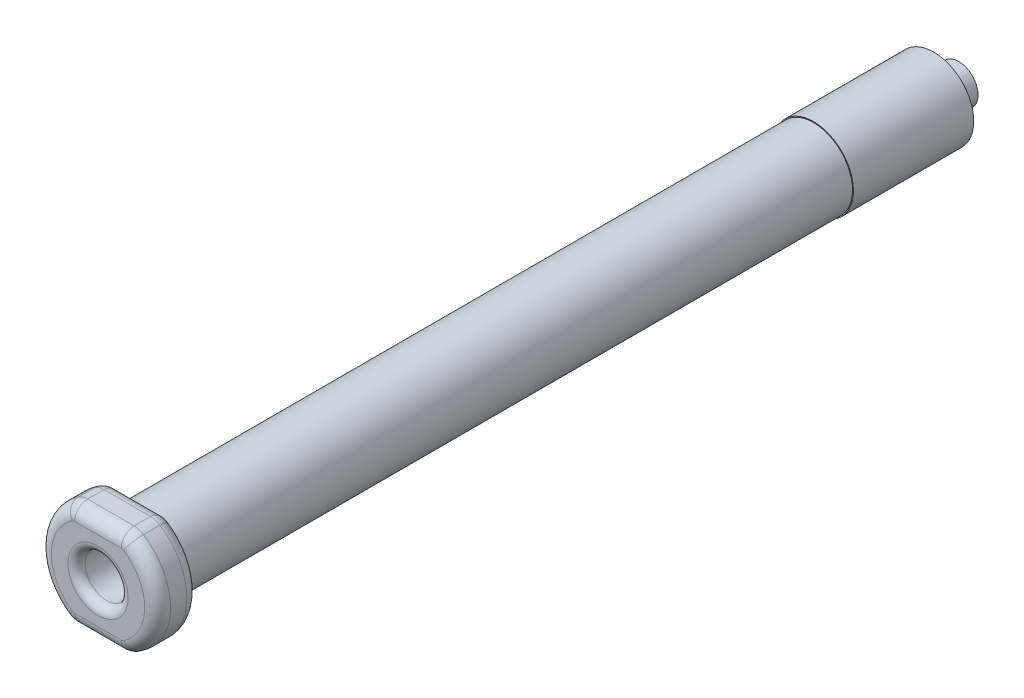
ISO-10303-21;
HEADER;
FILE_DESCRIPTION(('STEP AP214'),'2;1');
FILE_NAME('part.step','',(''),(''),'','','');
FILE_SCHEMA(('AUTOMOTIVE_DESIGN { 1 0 10303 214 1 1 1 1 }'));
ENDSEC;
DATA;
#1=APPLICATION_CONTEXT('core data for automotive mechanical design processes');
#2=APPLICATION_PROTOCOL_DEFINITION('international standard','automotive_design',2000,#1);
#3=PRODUCT_CONTEXT('',#1,'mechanical');
#4=PRODUCT('Part','Part','',(#3));
#5=PRODUCT_RELATED_PRODUCT_CATEGORY('part','',(#4));
#6=PRODUCT_DEFINITION_FORMATION('','',#4);
#7=PRODUCT_DEFINITION_CONTEXT('part definition',#1,'design');
#8=PRODUCT_DEFINITION('design','',#6,#7);
#9=PRODUCT_DEFINITION_SHAPE('','',#8);
#10=(LENGTH_UNIT() NAMED_UNIT(*) SI_UNIT(.MILLI.,.METRE.));
#11=(NAMED_UNIT(*) PLANE_ANGLE_UNIT() SI_UNIT($,.RADIAN.));
#12=(NAMED_UNIT(*) SI_UNIT($,.STERADIAN.) SOLID_ANGLE_UNIT());
#13=UNCERTAINTY_MEASURE_WITH_UNIT(LENGTH_MEASURE(1.E-05),#10,'distance_accuracy_value','');
#14=(GEOMETRIC_REPRESENTATION_CONTEXT(3) GLOBAL_UNCERTAINTY_ASSIGNED_CONTEXT((#13)) GLOBAL_UNIT_ASSIGNED_CONTEXT((#10,
#11,#12)) REPRESENTATION_CONTEXT('',''));
#15=CARTESIAN_POINT('',(0.,0.,0.));
#16=DIRECTION('',(0.,0.,1.));
#17=DIRECTION('',(1.,0.,0.));
#18=AXIS2_PLACEMENT_3D('',#15,#16,#17);
#19=CARTESIAN_POINT('',(0.,0.,83.25));
#20=DIRECTION('',(0.,0.,-1.));
#21=DIRECTION('',(-1.,0.,0.));
#22=AXIS2_PLACEMENT_3D('',#19,#20,#21);
#23=CYLINDRICAL_SURFACE('',#22,4.55);
#24=CARTESIAN_POINT('',(0.,0.,0.));
#25=DIRECTION('',(0.,0.,1.));
#26=DIRECTION('',(1.,0.,0.));
#27=AXIS2_PLACEMENT_3D('',#24,#25,#26);
#28=CIRCLE('',#27,4.55);
#29=CARTESIAN_POINT('',(4.55,0.,0.));
#30=VERTEX_POINT('',#29);
#31=EDGE_CURVE('E229',#30,#30,#28,.T.);
#32=ORIENTED_EDGE('',*,*,#31,.T.);
#33=EDGE_LOOP('',(#32));
#34=FACE_BOUND('',#33,.T.);
#35=CARTESIAN_POINT('',(0.,0.,78.35));
#36=DIRECTION('',(0.,0.,1.));
#37=DIRECTION('',(1.,0.,0.));
#38=AXIS2_PLACEMENT_3D('',#35,#36,#37);
#39=CIRCLE('',#38,4.55);
#40=CARTESIAN_POINT('',(4.55,0.,78.35));
#41=VERTEX_POINT('',#40);
#42=EDGE_CURVE('E491',#41,#41,#39,.T.);
#43=ORIENTED_EDGE('',*,*,#42,.F.);
#44=EDGE_LOOP('',(#43));
#45=FACE_BOUND('',#44,.T.);
#46=ADVANCED_FACE('F45',(#34,#45),#23,.T.);
#47=CARTESIAN_POINT('',(0.,0.,78.35));
#48=DIRECTION('',(0.,0.,1.));
#49=DIRECTION('',(1.,0.,0.));
#50=AXIS2_PLACEMENT_3D('',#47,#48,#49);
#51=CYLINDRICAL_SURFACE('',#50,6.93383912417933);
#52=DIRECTION('',(0.,0.,1.));
#53=VECTOR('',#52,1.);
#54=CARTESIAN_POINT('',(-3.80413679256897,5.79712586230652,78.35));
#55=LINE('',#54,#53);
#56=CARTESIAN_POINT('',(-3.80413679256897,5.79712586230652,81.75));
#57=VERTEX_POINT('',#56);
#58=CARTESIAN_POINT('',(-3.80413679256897,5.79712586230652,79.85));
#59=VERTEX_POINT('',#58);
#60=EDGE_CURVE('E431',#57,#59,#55,.F.);
#61=ORIENTED_EDGE('',*,*,#60,.T.);
#62=CARTESIAN_POINT('',(0.,0.,79.85));
#63=DIRECTION('',(0.,0.,1.));
#64=DIRECTION('',(1.,0.,0.));
#65=AXIS2_PLACEMENT_3D('',#62,#63,#64);
#66=CIRCLE('',#65,6.93383912417933);
#67=CARTESIAN_POINT('',(-3.80413679256897,-5.79712586230652,79.85));
#68=VERTEX_POINT('',#67);
#69=EDGE_CURVE('E253',#59,#68,#66,.T.);
#70=ORIENTED_EDGE('',*,*,#69,.T.);
#71=DIRECTION('',(0.,0.,1.));
#72=VECTOR('',#71,1.);
#73=CARTESIAN_POINT('',(-3.80413679256897,-5.79712586230652,78.35));
#74=LINE('',#73,#72);
#75=CARTESIAN_POINT('',(-3.80413679256897,-5.79712586230652,81.75));
#76=VERTEX_POINT('',#75);
#77=EDGE_CURVE('E429',#68,#76,#74,.T.);
#78=ORIENTED_EDGE('',*,*,#77,.T.);
#79=CARTESIAN_POINT('',(0.,0.,81.75));
#80=DIRECTION('',(0.,0.,1.));
#81=DIRECTION('',(1.,0.,0.));
#82=AXIS2_PLACEMENT_3D('',#79,#80,#81);
#83=CIRCLE('',#82,6.93383912417933);
#84=EDGE_CURVE('E199',#76,#57,#83,.F.);
#85=ORIENTED_EDGE('',*,*,#84,.T.);
#86=EDGE_LOOP('',(#61,#70,#78,#85));
#87=FACE_BOUND('',#86,.T.);
#88=ADVANCED_FACE('F298',(#87),#51,.T.);
#89=CARTESIAN_POINT('',(-3.25,6.125,78.35));
#90=DIRECTION('',(0.,1.,0.));
#91=DIRECTION('',(0.,0.,1.));
#92=AXIS2_PLACEMENT_3D('',#89,#90,#91);
#93=PLANE('',#92);
#94=DIRECTION('',(0.,0.,1.));
#95=VECTOR('',#94,1.);
#96=CARTESIAN_POINT('',(2.70686968716314,6.125,78.35));
#97=LINE('',#96,#95);
#98=CARTESIAN_POINT('',(2.70686968716314,6.125,81.75));
#99=VERTEX_POINT('',#98);
#100=CARTESIAN_POINT('',(2.70686968716314,6.125,79.85));
#101=VERTEX_POINT('',#100);
#102=EDGE_CURVE('E182',#99,#101,#97,.F.);
#103=ORIENTED_EDGE('',*,*,#102,.T.);
#104=DIRECTION('',(-1.,0.,0.));
#105=VECTOR('',#104,1.);
#106=CARTESIAN_POINT('',(-2.70686968716314,6.125,79.85));
#107=LINE('',#106,#105);
#108=CARTESIAN_POINT('',(-2.70686968716314,6.125,79.85));
#109=VERTEX_POINT('',#108);
#110=EDGE_CURVE('E257',#101,#109,#107,.T.);
#111=ORIENTED_EDGE('',*,*,#110,.T.);
#112=DIRECTION('',(0.,0.,1.));
#113=VECTOR('',#112,1.);
#114=CARTESIAN_POINT('',(-2.70686968716314,6.125,78.35));
#115=LINE('',#114,#113);
#116=CARTESIAN_POINT('',(-2.70686968716314,6.125,81.75));
#117=VERTEX_POINT('',#116);
#118=EDGE_CURVE('E449',#109,#117,#115,.T.);
#119=ORIENTED_EDGE('',*,*,#118,.T.);
#120=DIRECTION('',(-1.,0.,0.));
#121=VECTOR('',#120,1.);
#122=CARTESIAN_POINT('',(-3.25,6.125,81.75));
#123=LINE('',#122,#121);
#124=EDGE_CURVE('E204',#117,#99,#123,.F.);
#125=ORIENTED_EDGE('',*,*,#124,.T.);
#126=EDGE_LOOP('',(#103,#111,#119,#125));
#127=FACE_BOUND('',#126,.T.);
#128=ADVANCED_FACE('F304',(#127),#93,.T.);
#129=CARTESIAN_POINT('',(0.,0.,78.35));
#130=DIRECTION('',(0.,0.,1.));
#131=DIRECTION('',(1.,0.,0.));
#132=AXIS2_PLACEMENT_3D('',#129,#130,#131);
#133=CYLINDRICAL_SURFACE('',#132,6.93383912417933);
#134=DIRECTION('',(0.,0.,1.));
#135=VECTOR('',#134,1.);
#136=CARTESIAN_POINT('',(3.80413679256897,-5.79712586230652,78.35));
#137=LINE('',#136,#135);
#138=CARTESIAN_POINT('',(3.80413679256897,-5.79712586230652,81.75));
#139=VERTEX_POINT('',#138);
#140=CARTESIAN_POINT('',(3.80413679256897,-5.79712586230652,79.85));
#141=VERTEX_POINT('',#140);
#142=EDGE_CURVE('E447',#139,#141,#137,.F.);
#143=ORIENTED_EDGE('',*,*,#142,.T.);
#144=CARTESIAN_POINT('',(0.,0.,79.85));
#145=DIRECTION('',(0.,0.,1.));
#146=DIRECTION('',(1.,0.,0.));
#147=AXIS2_PLACEMENT_3D('',#144,#145,#146);
#148=CIRCLE('',#147,6.93383912417933);
#149=CARTESIAN_POINT('',(3.80413679256897,5.79712586230652,79.85));
#150=VERTEX_POINT('',#149);
#151=EDGE_CURVE('E60',#141,#150,#148,.T.);
#152=ORIENTED_EDGE('',*,*,#151,.T.);
#153=DIRECTION('',(0.,0.,1.));
#154=VECTOR('',#153,1.);
#155=CARTESIAN_POINT('',(3.80413679256897,5.79712586230652,78.35));
#156=LINE('',#155,#154);
#157=CARTESIAN_POINT('',(3.80413679256897,5.79712586230652,81.75));
#158=VERTEX_POINT('',#157);
#159=EDGE_CURVE('E445',#150,#158,#156,.T.);
#160=ORIENTED_EDGE('',*,*,#159,.T.);
#161=CARTESIAN_POINT('',(0.,0.,81.75));
#162=DIRECTION('',(0.,0.,1.));
#163=DIRECTION('',(1.,0.,0.));
#164=AXIS2_PLACEMENT_3D('',#161,#162,#163);
#165=CIRCLE('',#164,6.93383912417933);
#166=EDGE_CURVE('E209',#158,#139,#165,.F.);
#167=ORIENTED_EDGE('',*,*,#166,.T.);
#168=EDGE_LOOP('',(#143,#152,#160,#167));
#169=FACE_BOUND('',#168,.T.);
#170=ADVANCED_FACE('F318',(#169),#133,.T.);
#171=CARTESIAN_POINT('',(-3.25,-6.125,78.35));
#172=DIRECTION('',(0.,-1.,0.));
#173=DIRECTION('',(0.,0.,-1.));
#174=AXIS2_PLACEMENT_3D('',#171,#172,#173);
#175=PLANE('',#174);
#176=DIRECTION('',(0.,0.,1.));
#177=VECTOR('',#176,1.);
#178=CARTESIAN_POINT('',(-2.70686968716314,-6.125,78.35));
#179=LINE('',#178,#177);
#180=CARTESIAN_POINT('',(-2.70686968716314,-6.125,81.75));
#181=VERTEX_POINT('',#180);
#182=CARTESIAN_POINT('',(-2.70686968716314,-6.125,79.85));
#183=VERTEX_POINT('',#182);
#184=EDGE_CURVE('E438',#181,#183,#179,.F.);
#185=ORIENTED_EDGE('',*,*,#184,.T.);
#186=DIRECTION('',(1.,0.,0.));
#187=VECTOR('',#186,1.);
#188=CARTESIAN_POINT('',(2.70686968716314,-6.125,79.85));
#189=LINE('',#188,#187);
#190=CARTESIAN_POINT('',(2.70686968716314,-6.125,79.85));
#191=VERTEX_POINT('',#190);
#192=EDGE_CURVE('E249',#183,#191,#189,.T.);
#193=ORIENTED_EDGE('',*,*,#192,.T.);
#194=DIRECTION('',(0.,0.,1.));
#195=VECTOR('',#194,1.);
#196=CARTESIAN_POINT('',(2.70686968716314,-6.125,78.35));
#197=LINE('',#196,#195);
#198=CARTESIAN_POINT('',(2.70686968716314,-6.125,81.75));
#199=VERTEX_POINT('',#198);
#200=EDGE_CURVE('E436',#191,#199,#197,.T.);
#201=ORIENTED_EDGE('',*,*,#200,.T.);
#202=DIRECTION('',(1.,0.,0.));
#203=VECTOR('',#202,1.);
#204=CARTESIAN_POINT('',(-3.25,-6.125,81.75));
#205=LINE('',#204,#203);
#206=EDGE_CURVE('E189',#199,#181,#205,.F.);
#207=ORIENTED_EDGE('',*,*,#206,.T.);
#208=EDGE_LOOP('',(#185,#193,#201,#207));
#209=FACE_BOUND('',#208,.T.);
#210=ADVANCED_FACE('F315',(#209),#175,.T.);
#211=CARTESIAN_POINT('',(0.,0.,78.35));
#212=DIRECTION('',(0.,0.,1.));
#213=DIRECTION('',(1.,0.,0.));
#214=AXIS2_PLACEMENT_3D('',#211,#212,#213);
#215=PLANE('',#214);
#216=CARTESIAN_POINT('',(0.,0.,78.35));
#217=DIRECTION('',(0.,0.,1.));
#218=DIRECTION('',(1.,0.,0.));
#219=AXIS2_PLACEMENT_3D('',#216,#217,#218);
#220=CIRCLE('',#219,5.43383912417933);
#221=CARTESIAN_POINT('',(2.9811864635146,4.54303146557663,78.35));
#222=VERTEX_POINT('',#221);
#223=CARTESIAN_POINT('',(2.9811864635146,-4.54303146557663,78.35));
#224=VERTEX_POINT('',#223);
#225=EDGE_CURVE('E210',#222,#224,#220,.F.);
#226=ORIENTED_EDGE('',*,*,#225,.T.);
#227=CARTESIAN_POINT('',(2.70686968716314,-4.125,78.35));
#228=DIRECTION('',(0.,0.,1.));
#229=DIRECTION('',(1.,0.,0.));
#230=AXIS2_PLACEMENT_3D('',#227,#228,#229);
#231=CIRCLE('',#230,0.5);
#232=CARTESIAN_POINT('',(2.70686968716314,-4.625,78.35));
#233=VERTEX_POINT('',#232);
#234=EDGE_CURVE('E243',#224,#233,#231,.F.);
#235=ORIENTED_EDGE('',*,*,#234,.T.);
#236=DIRECTION('',(1.,0.,0.));
#237=VECTOR('',#236,1.);
#238=CARTESIAN_POINT('',(-2.70686968716314,-4.625,78.35));
#239=LINE('',#238,#237);
#240=CARTESIAN_POINT('',(-2.70686968716314,-4.625,78.35));
#241=VERTEX_POINT('',#240);
#242=EDGE_CURVE('E241',#233,#241,#239,.F.);
#243=ORIENTED_EDGE('',*,*,#242,.T.);
#244=CARTESIAN_POINT('',(-2.70686968716314,-4.125,78.35));
#245=DIRECTION('',(0.,0.,1.));
#246=DIRECTION('',(1.,0.,0.));
#247=AXIS2_PLACEMENT_3D('',#244,#245,#246);
#248=CIRCLE('',#247,0.5);
#249=CARTESIAN_POINT('',(-2.9811864635146,-4.54303146557663,78.35));
#250=VERTEX_POINT('',#249);
#251=EDGE_CURVE('E239',#241,#250,#248,.F.);
#252=ORIENTED_EDGE('',*,*,#251,.T.);
#253=CARTESIAN_POINT('',(0.,0.,78.35));
#254=DIRECTION('',(0.,0.,1.));
#255=DIRECTION('',(1.,0.,0.));
#256=AXIS2_PLACEMENT_3D('',#253,#254,#255);
#257=CIRCLE('',#256,5.43383912417933);
#258=CARTESIAN_POINT('',(-2.9811864635146,4.54303146557663,78.35));
#259=VERTEX_POINT('',#258);
#260=EDGE_CURVE('E237',#250,#259,#257,.F.);
#261=ORIENTED_EDGE('',*,*,#260,.T.);
#262=CARTESIAN_POINT('',(-2.70686968716314,4.125,78.35));
#263=DIRECTION('',(0.,0.,1.));
#264=DIRECTION('',(1.,0.,0.));
#265=AXIS2_PLACEMENT_3D('',#262,#263,#264);
#266=CIRCLE('',#265,0.5);
#267=CARTESIAN_POINT('',(-2.70686968716314,4.625,78.35));
#268=VERTEX_POINT('',#267);
#269=EDGE_CURVE('E235',#259,#268,#266,.F.);
#270=ORIENTED_EDGE('',*,*,#269,.T.);
#271=DIRECTION('',(-1.,0.,0.));
#272=VECTOR('',#271,1.);
#273=CARTESIAN_POINT('',(2.70686968716314,4.625,78.35));
#274=LINE('',#273,#272);
#275=CARTESIAN_POINT('',(2.70686968716314,4.625,78.35));
#276=VERTEX_POINT('',#275);
#277=EDGE_CURVE('E233',#268,#276,#274,.F.);
#278=ORIENTED_EDGE('',*,*,#277,.T.);
#279=CARTESIAN_POINT('',(2.70686968716314,4.125,78.35));
#280=DIRECTION('',(0.,0.,1.));
#281=DIRECTION('',(1.,0.,0.));
#282=AXIS2_PLACEMENT_3D('',#279,#280,#281);
#283=CIRCLE('',#282,0.5);
#284=EDGE_CURVE('E231',#276,#222,#283,.F.);
#285=ORIENTED_EDGE('',*,*,#284,.T.);
#286=EDGE_LOOP('',(#226,#235,#243,#252,#261,#270,#278,#285));
#287=FACE_BOUND('',#286,.T.);
#288=ORIENTED_EDGE('',*,*,#42,.T.);
#289=EDGE_LOOP('',(#288));
#290=FACE_BOUND('',#289,.T.);
#291=ADVANCED_FACE('F312',(#287,#290),#215,.F.);
#292=CARTESIAN_POINT('',(0.,0.,83.25));
#293=DIRECTION('',(0.,0.,1.));
#294=DIRECTION('',(1.,0.,0.));
#295=AXIS2_PLACEMENT_3D('',#292,#293,#294);
#296=PLANE('',#295);
#297=CARTESIAN_POINT('',(0.,0.,83.25));
#298=DIRECTION('',(0.,0.,1.));
#299=DIRECTION('',(1.,0.,0.));
#300=AXIS2_PLACEMENT_3D('',#297,#298,#299);
#301=CIRCLE('',#300,3.5);
#302=CARTESIAN_POINT('',(3.5,0.,83.25));
#303=VERTEX_POINT('',#302);
#304=EDGE_CURVE('E12',#303,#303,#301,.F.);
#305=ORIENTED_EDGE('',*,*,#304,.T.);
#306=EDGE_LOOP('',(#305));
#307=FACE_BOUND('',#306,.T.);
#308=DIRECTION('',(1.,0.,0.));
#309=VECTOR('',#308,1.);
#310=CARTESIAN_POINT('',(0.,-4.625,83.25));
#311=LINE('',#310,#309);
#312=CARTESIAN_POINT('',(-2.70686968716314,-4.625,83.25));
#313=VERTEX_POINT('',#312);
#314=CARTESIAN_POINT('',(2.70686968716314,-4.625,83.25));
#315=VERTEX_POINT('',#314);
#316=EDGE_CURVE('E186',#313,#315,#311,.T.);
#317=ORIENTED_EDGE('',*,*,#316,.T.);
#318=CARTESIAN_POINT('',(2.70686968716314,-4.125,83.25));
#319=DIRECTION('',(0.,0.,1.));
#320=DIRECTION('',(1.,0.,0.));
#321=AXIS2_PLACEMENT_3D('',#318,#319,#320);
#322=CIRCLE('',#321,0.5);
#323=CARTESIAN_POINT('',(2.9811864635146,-4.54303146557663,83.25));
#324=VERTEX_POINT('',#323);
#325=EDGE_CURVE('E166',#315,#324,#322,.T.);
#326=ORIENTED_EDGE('',*,*,#325,.T.);
#327=CARTESIAN_POINT('',(0.,0.,83.25));
#328=DIRECTION('',(0.,0.,1.));
#329=DIRECTION('',(1.,0.,0.));
#330=AXIS2_PLACEMENT_3D('',#327,#328,#329);
#331=CIRCLE('',#330,5.43383912417933);
#332=CARTESIAN_POINT('',(2.9811864635146,4.54303146557663,83.25));
#333=VERTEX_POINT('',#332);
#334=EDGE_CURVE('E175',#324,#333,#331,.T.);
#335=ORIENTED_EDGE('',*,*,#334,.T.);
#336=CARTESIAN_POINT('',(2.70686968716314,4.125,83.25));
#337=DIRECTION('',(0.,0.,1.));
#338=DIRECTION('',(1.,0.,0.));
#339=AXIS2_PLACEMENT_3D('',#336,#337,#338);
#340=CIRCLE('',#339,0.5);
#341=CARTESIAN_POINT('',(2.70686968716314,4.625,83.25));
#342=VERTEX_POINT('',#341);
#343=EDGE_CURVE('E181',#333,#342,#340,.T.);
#344=ORIENTED_EDGE('',*,*,#343,.T.);
#345=DIRECTION('',(-1.,0.,0.));
#346=VECTOR('',#345,1.);
#347=CARTESIAN_POINT('',(0.,4.625,83.25));
#348=LINE('',#347,#346);
#349=CARTESIAN_POINT('',(-2.70686968716314,4.625,83.25));
#350=VERTEX_POINT('',#349);
#351=EDGE_CURVE('E453',#342,#350,#348,.T.);
#352=ORIENTED_EDGE('',*,*,#351,.T.);
#353=CARTESIAN_POINT('',(-2.70686968716314,4.125,83.25));
#354=DIRECTION('',(0.,0.,1.));
#355=DIRECTION('',(1.,0.,0.));
#356=AXIS2_PLACEMENT_3D('',#353,#354,#355);
#357=CIRCLE('',#356,0.5);
#358=CARTESIAN_POINT('',(-2.9811864635146,4.54303146557663,83.25));
#359=VERTEX_POINT('',#358);
#360=EDGE_CURVE('E455',#350,#359,#357,.T.);
#361=ORIENTED_EDGE('',*,*,#360,.T.);
#362=CARTESIAN_POINT('',(0.,0.,83.25));
#363=DIRECTION('',(0.,0.,1.));
#364=DIRECTION('',(1.,0.,0.));
#365=AXIS2_PLACEMENT_3D('',#362,#363,#364);
#366=CIRCLE('',#365,5.43383912417933);
#367=CARTESIAN_POINT('',(-2.9811864635146,-4.54303146557663,83.25));
#368=VERTEX_POINT('',#367);
#369=EDGE_CURVE('E457',#359,#368,#366,.T.);
#370=ORIENTED_EDGE('',*,*,#369,.T.);
#371=CARTESIAN_POINT('',(-2.70686968716314,-4.125,83.25));
#372=DIRECTION('',(0.,0.,1.));
#373=DIRECTION('',(1.,0.,0.));
#374=AXIS2_PLACEMENT_3D('',#371,#372,#373);
#375=CIRCLE('',#374,0.5);
#376=EDGE_CURVE('E191',#368,#313,#375,.T.);
#377=ORIENTED_EDGE('',*,*,#376,.T.);
#378=EDGE_LOOP('',(#317,#326,#335,#344,#352,#361,#370,#377));
#379=FACE_BOUND('',#378,.T.);
#380=ADVANCED_FACE('F184',(#307,#379),#296,.T.);
#381=CARTESIAN_POINT('',(0.,0.,-14.));
#382=DIRECTION('',(0.,0.,1.));
#383=DIRECTION('',(1.,0.,0.));
#384=AXIS2_PLACEMENT_3D('',#381,#382,#383);
#385=CYLINDRICAL_SURFACE('',#384,4.65);
#386=CARTESIAN_POINT('',(0.,0.,-14.));
#387=DIRECTION('',(0.,0.,-1.));
#388=DIRECTION('',(-1.,0.,0.));
#389=AXIS2_PLACEMENT_3D('',#386,#387,#388);
#390=CIRCLE('',#389,4.65);
#391=CARTESIAN_POINT('',(-4.65,0.,-14.));
#392=VERTEX_POINT('',#391);
#393=EDGE_CURVE('E495',#392,#392,#390,.T.);
#394=ORIENTED_EDGE('',*,*,#393,.F.);
#395=EDGE_LOOP('',(#394));
#396=FACE_BOUND('',#395,.T.);
#397=CARTESIAN_POINT('',(0.,0.,0.));
#398=DIRECTION('',(0.,0.,-1.));
#399=DIRECTION('',(-1.,0.,0.));
#400=AXIS2_PLACEMENT_3D('',#397,#398,#399);
#401=CIRCLE('',#400,4.65);
#402=CARTESIAN_POINT('',(-4.65,0.,0.));
#403=VERTEX_POINT('',#402);
#404=EDGE_CURVE('E492',#403,#403,#401,.T.);
#405=ORIENTED_EDGE('',*,*,#404,.T.);
#406=EDGE_LOOP('',(#405));
#407=FACE_BOUND('',#406,.T.);
#408=ADVANCED_FACE('F311',(#396,#407),#385,.T.);
#409=CARTESIAN_POINT('',(0.,0.,-14.));
#410=DIRECTION('',(0.,0.,-1.));
#411=DIRECTION('',(-1.,0.,0.));
#412=AXIS2_PLACEMENT_3D('',#409,#410,#411);
#413=PLANE('',#412);
#414=CARTESIAN_POINT('',(0.,0.,-14.));
#415=DIRECTION('',(0.,0.,-1.));
#416=DIRECTION('',(-1.,0.,0.));
#417=AXIS2_PLACEMENT_3D('',#414,#415,#416);
#418=CIRCLE('',#417,4.5);
#419=CARTESIAN_POINT('',(-4.5,0.,-14.));
#420=VERTEX_POINT('',#419);
#421=EDGE_CURVE('E501',#420,#420,#418,.T.);
#422=ORIENTED_EDGE('',*,*,#421,.F.);
#423=EDGE_LOOP('',(#422));
#424=FACE_BOUND('',#423,.T.);
#425=ORIENTED_EDGE('',*,*,#393,.T.);
#426=EDGE_LOOP('',(#425));
#427=FACE_BOUND('',#426,.T.);
#428=ADVANCED_FACE('F330',(#424,#427),#413,.T.);
#429=CARTESIAN_POINT('',(0.,0.,0.));
#430=DIRECTION('',(0.,0.,-1.));
#431=DIRECTION('',(-1.,0.,0.));
#432=AXIS2_PLACEMENT_3D('',#429,#430,#431);
#433=PLANE('',#432);
#434=ORIENTED_EDGE('',*,*,#31,.F.);
#435=EDGE_LOOP('',(#434));
#436=FACE_BOUND('',#435,.T.);
#437=ORIENTED_EDGE('',*,*,#404,.F.);
#438=EDGE_LOOP('',(#437));
#439=FACE_BOUND('',#438,.T.);
#440=ADVANCED_FACE('F332',(#436,#439),#433,.F.);
#441=CARTESIAN_POINT('',(0.,0.,0.));
#442=DIRECTION('',(0.,0.,-1.));
#443=DIRECTION('',(-1.,0.,0.));
#444=AXIS2_PLACEMENT_3D('',#441,#442,#443);
#445=CYLINDRICAL_SURFACE('',#444,4.5);
#446=CARTESIAN_POINT('',(0.,0.,0.));
#447=DIRECTION('',(0.,0.,-1.));
#448=DIRECTION('',(-1.,0.,0.));
#449=AXIS2_PLACEMENT_3D('',#446,#447,#448);
#450=CIRCLE('',#449,4.5);
#451=CARTESIAN_POINT('',(-4.5,0.,0.));
#452=VERTEX_POINT('',#451);
#453=EDGE_CURVE('E440',#452,#452,#450,.T.);
#454=ORIENTED_EDGE('',*,*,#453,.F.);
#455=EDGE_LOOP('',(#454));
#456=FACE_BOUND('',#455,.T.);
#457=ORIENTED_EDGE('',*,*,#421,.T.);
#458=EDGE_LOOP('',(#457));
#459=FACE_BOUND('',#458,.T.);
#460=ADVANCED_FACE('F335',(#456,#459),#445,.F.);
#461=CARTESIAN_POINT('',(0.,0.,0.));
#462=DIRECTION('',(0.,0.,-1.));
#463=DIRECTION('',(-1.,0.,0.));
#464=AXIS2_PLACEMENT_3D('',#461,#462,#463);
#465=PLANE('',#464);
#466=CARTESIAN_POINT('',(0.,0.,0.));
#467=DIRECTION('',(0.,0.,-1.));
#468=DIRECTION('',(-1.,0.,0.));
#469=AXIS2_PLACEMENT_3D('',#466,#467,#468);
#470=CIRCLE('',#469,2.5);
#471=CARTESIAN_POINT('',(-2.5,0.,0.));
#472=VERTEX_POINT('',#471);
#473=EDGE_CURVE('E504',#472,#472,#470,.F.);
#474=ORIENTED_EDGE('',*,*,#473,.T.);
#475=EDGE_LOOP('',(#474));
#476=FACE_BOUND('',#475,.T.);
#477=ORIENTED_EDGE('',*,*,#453,.T.);
#478=EDGE_LOOP('',(#477));
#479=FACE_BOUND('',#478,.T.);
#480=ADVANCED_FACE('F342',(#476,#479),#465,.T.);
#481=CARTESIAN_POINT('',(0.,0.,-7.07106781186548));
#482=DIRECTION('',(0.,0.,1.));
#483=DIRECTION('',(1.,0.,0.));
#484=AXIS2_PLACEMENT_3D('',#481,#482,#483);
#485=CYLINDRICAL_SURFACE('',#484,2.5);
#486=CARTESIAN_POINT('',(0.,0.,82.25));
#487=DIRECTION('',(0.,0.,1.));
#488=DIRECTION('',(1.,0.,0.));
#489=AXIS2_PLACEMENT_3D('',#486,#487,#488);
#490=CIRCLE('',#489,2.5);
#491=CARTESIAN_POINT('',(2.5,0.,82.25));
#492=VERTEX_POINT('',#491);
#493=EDGE_CURVE('E53',#492,#492,#490,.T.);
#494=ORIENTED_EDGE('',*,*,#493,.T.);
#495=EDGE_LOOP('',(#494));
#496=FACE_BOUND('',#495,.T.);
#497=ORIENTED_EDGE('',*,*,#473,.F.);
#498=EDGE_LOOP('',(#497));
#499=FACE_BOUND('',#498,.T.);
#500=ADVANCED_FACE('F284',(#496,#499),#485,.F.);
#501=CARTESIAN_POINT('',(-2.70686968716314,-4.125,78.35));
#502=DIRECTION('',(0.,0.,1.));
#503=DIRECTION('',(1.,0.,0.));
#504=AXIS2_PLACEMENT_3D('',#501,#502,#503);
#505=CYLINDRICAL_SURFACE('',#504,2.);
#506=ORIENTED_EDGE('',*,*,#77,.F.);
#507=CARTESIAN_POINT('',(-2.70686968716314,-4.125,79.85));
#508=DIRECTION('',(0.,0.,1.));
#509=DIRECTION('',(1.,0.,0.));
#510=AXIS2_PLACEMENT_3D('',#507,#508,#509);
#511=CIRCLE('',#510,2.);
#512=EDGE_CURVE('E251',#68,#183,#511,.T.);
#513=ORIENTED_EDGE('',*,*,#512,.T.);
#514=ORIENTED_EDGE('',*,*,#184,.F.);
#515=CARTESIAN_POINT('',(-2.70686968716314,-4.125,81.75));
#516=DIRECTION('',(0.,0.,1.));
#517=DIRECTION('',(1.,0.,0.));
#518=AXIS2_PLACEMENT_3D('',#515,#516,#517);
#519=CIRCLE('',#518,2.);
#520=EDGE_CURVE('E196',#181,#76,#519,.F.);
#521=ORIENTED_EDGE('',*,*,#520,.T.);
#522=EDGE_LOOP('',(#506,#513,#514,#521));
#523=FACE_BOUND('',#522,.T.);
#524=ADVANCED_FACE('F349',(#523),#505,.T.);
#525=CARTESIAN_POINT('',(2.70686968716314,-4.125,78.35));
#526=DIRECTION('',(0.,0.,1.));
#527=DIRECTION('',(1.,0.,0.));
#528=AXIS2_PLACEMENT_3D('',#525,#526,#527);
#529=CYLINDRICAL_SURFACE('',#528,2.);
#530=ORIENTED_EDGE('',*,*,#200,.F.);
#531=CARTESIAN_POINT('',(2.70686968716314,-4.125,79.85));
#532=DIRECTION('',(0.,0.,1.));
#533=DIRECTION('',(1.,0.,0.));
#534=AXIS2_PLACEMENT_3D('',#531,#532,#533);
#535=CIRCLE('',#534,2.);
#536=EDGE_CURVE('E246',#191,#141,#535,.T.);
#537=ORIENTED_EDGE('',*,*,#536,.T.);
#538=ORIENTED_EDGE('',*,*,#142,.F.);
#539=CARTESIAN_POINT('',(2.70686968716314,-4.125,81.75));
#540=DIRECTION('',(0.,0.,1.));
#541=DIRECTION('',(1.,0.,0.));
#542=AXIS2_PLACEMENT_3D('',#539,#540,#541);
#543=CIRCLE('',#542,2.);
#544=EDGE_CURVE('E168',#139,#199,#543,.F.);
#545=ORIENTED_EDGE('',*,*,#544,.T.);
#546=EDGE_LOOP('',(#530,#537,#538,#545));
#547=FACE_BOUND('',#546,.T.);
#548=ADVANCED_FACE('F352',(#547),#529,.T.);
#549=CARTESIAN_POINT('',(2.70686968716314,4.125,78.35));
#550=DIRECTION('',(0.,0.,1.));
#551=DIRECTION('',(1.,0.,0.));
#552=AXIS2_PLACEMENT_3D('',#549,#550,#551);
#553=CYLINDRICAL_SURFACE('',#552,2.);
#554=ORIENTED_EDGE('',*,*,#159,.F.);
#555=CARTESIAN_POINT('',(2.70686968716314,4.125,79.85));
#556=DIRECTION('',(0.,0.,1.));
#557=DIRECTION('',(1.,0.,0.));
#558=AXIS2_PLACEMENT_3D('',#555,#556,#557);
#559=CIRCLE('',#558,2.);
#560=EDGE_CURVE('E67',#150,#101,#559,.T.);
#561=ORIENTED_EDGE('',*,*,#560,.T.);
#562=ORIENTED_EDGE('',*,*,#102,.F.);
#563=CARTESIAN_POINT('',(2.70686968716314,4.125,81.75));
#564=DIRECTION('',(0.,0.,1.));
#565=DIRECTION('',(1.,0.,0.));
#566=AXIS2_PLACEMENT_3D('',#563,#564,#565);
#567=CIRCLE('',#566,2.);
#568=EDGE_CURVE('E206',#99,#158,#567,.F.);
#569=ORIENTED_EDGE('',*,*,#568,.T.);
#570=EDGE_LOOP('',(#554,#561,#562,#569));
#571=FACE_BOUND('',#570,.T.);
#572=ADVANCED_FACE('F356',(#571),#553,.T.);
#573=CARTESIAN_POINT('',(-2.70686968716314,4.125,78.35));
#574=DIRECTION('',(0.,0.,1.));
#575=DIRECTION('',(1.,0.,0.));
#576=AXIS2_PLACEMENT_3D('',#573,#574,#575);
#577=CYLINDRICAL_SURFACE('',#576,2.);
#578=ORIENTED_EDGE('',*,*,#118,.F.);
#579=CARTESIAN_POINT('',(-2.70686968716314,4.125,79.85));
#580=DIRECTION('',(0.,0.,1.));
#581=DIRECTION('',(1.,0.,0.));
#582=AXIS2_PLACEMENT_3D('',#579,#580,#581);
#583=CIRCLE('',#582,2.);
#584=EDGE_CURVE('E255',#109,#59,#583,.T.);
#585=ORIENTED_EDGE('',*,*,#584,.T.);
#586=ORIENTED_EDGE('',*,*,#60,.F.);
#587=CARTESIAN_POINT('',(-2.70686968716314,4.125,81.75));
#588=DIRECTION('',(0.,0.,1.));
#589=DIRECTION('',(1.,0.,0.));
#590=AXIS2_PLACEMENT_3D('',#587,#588,#589);
#591=CIRCLE('',#590,2.);
#592=EDGE_CURVE('E201',#57,#117,#591,.F.);
#593=ORIENTED_EDGE('',*,*,#592,.T.);
#594=EDGE_LOOP('',(#578,#585,#586,#593));
#595=FACE_BOUND('',#594,.T.);
#596=ADVANCED_FACE('F360',(#595),#577,.T.);
#597=CARTESIAN_POINT('',(-2.70686968716314,4.125,81.75));
#598=DIRECTION('',(0.,0.,1.));
#599=DIRECTION('',(1.,0.,0.));
#600=AXIS2_PLACEMENT_3D('',#597,#598,#599);
#601=DEGENERATE_TOROIDAL_SURFACE('',#600,0.5,1.5,.T.);
#602=CARTESIAN_POINT('',(-2.70686968716314,4.625,81.75));
#603=DIRECTION('',(1.,0.,0.));
#604=DIRECTION('',(0.,0.,-1.));
#605=AXIS2_PLACEMENT_3D('',#602,#603,#604);
#606=CIRCLE('',#605,1.5);
#607=EDGE_CURVE('E223',#117,#350,#606,.T.);
#608=ORIENTED_EDGE('',*,*,#607,.F.);
#609=ORIENTED_EDGE('',*,*,#592,.F.);
#610=CARTESIAN_POINT('',(-2.9811864635146,4.54303146557663,81.75));
#611=DIRECTION('',(-0.836062931153259,-0.548633552702914,0.));
#612=DIRECTION('',(0.548633552702914,-0.836062931153259,0.));
#613=AXIS2_PLACEMENT_3D('',#610,#611,#612);
#614=CIRCLE('',#613,1.5);
#615=EDGE_CURVE('E226',#359,#57,#614,.T.);
#616=ORIENTED_EDGE('',*,*,#615,.F.);
#617=ORIENTED_EDGE('',*,*,#360,.F.);
#618=EDGE_LOOP('',(#608,#609,#616,#617));
#619=FACE_BOUND('',#618,.T.);
#620=ADVANCED_FACE('F363',(#619),#601,.T.);
#621=CARTESIAN_POINT('',(0.,0.,81.75));
#622=DIRECTION('',(0.,0.,1.));
#623=DIRECTION('',(1.,0.,0.));
#624=AXIS2_PLACEMENT_3D('',#621,#622,#623);
#625=TOROIDAL_SURFACE('',#624,5.43383912417933,1.5);
#626=ORIENTED_EDGE('',*,*,#615,.T.);
#627=ORIENTED_EDGE('',*,*,#84,.F.);
#628=CARTESIAN_POINT('',(-2.9811864635146,-4.54303146557663,81.75));
#629=DIRECTION('',(0.836062931153259,-0.548633552702914,0.));
#630=DIRECTION('',(0.548633552702914,0.836062931153259,0.));
#631=AXIS2_PLACEMENT_3D('',#628,#629,#630);
#632=CIRCLE('',#631,1.5);
#633=EDGE_CURVE('E220',#368,#76,#632,.T.);
#634=ORIENTED_EDGE('',*,*,#633,.F.);
#635=ORIENTED_EDGE('',*,*,#369,.F.);
#636=EDGE_LOOP('',(#626,#627,#634,#635));
#637=FACE_BOUND('',#636,.T.);
#638=ADVANCED_FACE('F385',(#637),#625,.T.);
#639=CARTESIAN_POINT('',(0.,4.625,81.75));
#640=DIRECTION('',(-1.,0.,0.));
#641=DIRECTION('',(0.,0.,1.));
#642=AXIS2_PLACEMENT_3D('',#639,#640,#641);
#643=CYLINDRICAL_SURFACE('',#642,1.5);
#644=ORIENTED_EDGE('',*,*,#607,.T.);
#645=ORIENTED_EDGE('',*,*,#351,.F.);
#646=CARTESIAN_POINT('',(2.70686968716314,4.625,81.75));
#647=DIRECTION('',(1.,0.,0.));
#648=DIRECTION('',(0.,0.,-1.));
#649=AXIS2_PLACEMENT_3D('',#646,#647,#648);
#650=CIRCLE('',#649,1.5);
#651=EDGE_CURVE('E217',#99,#342,#650,.T.);
#652=ORIENTED_EDGE('',*,*,#651,.F.);
#653=ORIENTED_EDGE('',*,*,#124,.F.);
#654=EDGE_LOOP('',(#644,#645,#652,#653));
#655=FACE_BOUND('',#654,.T.);
#656=ADVANCED_FACE('F381',(#655),#643,.T.);
#657=CARTESIAN_POINT('',(-2.70686968716314,-4.125,81.75));
#658=DIRECTION('',(0.,0.,1.));
#659=DIRECTION('',(1.,0.,0.));
#660=AXIS2_PLACEMENT_3D('',#657,#658,#659);
#661=DEGENERATE_TOROIDAL_SURFACE('',#660,0.5,1.5,.T.);
#662=ORIENTED_EDGE('',*,*,#633,.T.);
#663=ORIENTED_EDGE('',*,*,#520,.F.);
#664=CARTESIAN_POINT('',(-2.70686968716314,-4.625,81.75));
#665=DIRECTION('',(1.,0.,0.));
#666=DIRECTION('',(0.,0.,-1.));
#667=AXIS2_PLACEMENT_3D('',#664,#665,#666);
#668=CIRCLE('',#667,1.5);
#669=EDGE_CURVE('E214',#313,#181,#668,.T.);
#670=ORIENTED_EDGE('',*,*,#669,.F.);
#671=ORIENTED_EDGE('',*,*,#376,.F.);
#672=EDGE_LOOP('',(#662,#663,#670,#671));
#673=FACE_BOUND('',#672,.T.);
#674=ADVANCED_FACE('F377',(#673),#661,.T.);
#675=CARTESIAN_POINT('',(2.70686968716314,4.125,81.75));
#676=DIRECTION('',(0.,0.,1.));
#677=DIRECTION('',(1.,0.,0.));
#678=AXIS2_PLACEMENT_3D('',#675,#676,#677);
#679=DEGENERATE_TOROIDAL_SURFACE('',#678,0.5,1.5,.T.);
#680=ORIENTED_EDGE('',*,*,#651,.T.);
#681=ORIENTED_EDGE('',*,*,#343,.F.);
#682=CARTESIAN_POINT('',(2.9811864635146,4.54303146557663,81.75));
#683=DIRECTION('',(0.836062931153259,-0.548633552702914,0.));
#684=DIRECTION('',(0.548633552702914,0.836062931153259,0.));
#685=AXIS2_PLACEMENT_3D('',#682,#683,#684);
#686=CIRCLE('',#685,1.5);
#687=EDGE_CURVE('E178',#158,#333,#686,.T.);
#688=ORIENTED_EDGE('',*,*,#687,.F.);
#689=ORIENTED_EDGE('',*,*,#568,.F.);
#690=EDGE_LOOP('',(#680,#681,#688,#689));
#691=FACE_BOUND('',#690,.T.);
#692=ADVANCED_FACE('F373',(#691),#679,.T.);
#693=CARTESIAN_POINT('',(0.,-4.625,81.75));
#694=DIRECTION('',(1.,0.,0.));
#695=DIRECTION('',(0.,0.,-1.));
#696=AXIS2_PLACEMENT_3D('',#693,#694,#695);
#697=CYLINDRICAL_SURFACE('',#696,1.5);
#698=ORIENTED_EDGE('',*,*,#669,.T.);
#699=ORIENTED_EDGE('',*,*,#206,.F.);
#700=CARTESIAN_POINT('',(2.70686968716314,-4.625,81.75));
#701=DIRECTION('',(1.,0.,0.));
#702=DIRECTION('',(0.,0.,-1.));
#703=AXIS2_PLACEMENT_3D('',#700,#701,#702);
#704=CIRCLE('',#703,1.5);
#705=EDGE_CURVE('E171',#315,#199,#704,.T.);
#706=ORIENTED_EDGE('',*,*,#705,.F.);
#707=ORIENTED_EDGE('',*,*,#316,.F.);
#708=EDGE_LOOP('',(#698,#699,#706,#707));
#709=FACE_BOUND('',#708,.T.);
#710=ADVANCED_FACE('F370',(#709),#697,.T.);
#711=CARTESIAN_POINT('',(0.,0.,81.75));
#712=DIRECTION('',(0.,0.,1.));
#713=DIRECTION('',(1.,0.,0.));
#714=AXIS2_PLACEMENT_3D('',#711,#712,#713);
#715=TOROIDAL_SURFACE('',#714,5.43383912417933,1.5);
#716=ORIENTED_EDGE('',*,*,#687,.T.);
#717=ORIENTED_EDGE('',*,*,#334,.F.);
#718=CARTESIAN_POINT('',(2.9811864635146,-4.54303146557663,81.75));
#719=DIRECTION('',(-0.836062931153259,-0.548633552702914,0.));
#720=DIRECTION('',(0.548633552702914,-0.836062931153259,0.));
#721=AXIS2_PLACEMENT_3D('',#718,#719,#720);
#722=CIRCLE('',#721,1.5);
#723=EDGE_CURVE('E161',#139,#324,#722,.T.);
#724=ORIENTED_EDGE('',*,*,#723,.F.);
#725=ORIENTED_EDGE('',*,*,#166,.F.);
#726=EDGE_LOOP('',(#716,#717,#724,#725));
#727=FACE_BOUND('',#726,.T.);
#728=ADVANCED_FACE('F176',(#727),#715,.T.);
#729=CARTESIAN_POINT('',(2.70686968716314,-4.125,81.75));
#730=DIRECTION('',(0.,0.,1.));
#731=DIRECTION('',(1.,0.,0.));
#732=AXIS2_PLACEMENT_3D('',#729,#730,#731);
#733=DEGENERATE_TOROIDAL_SURFACE('',#732,0.5,1.5,.T.);
#734=ORIENTED_EDGE('',*,*,#705,.T.);
#735=ORIENTED_EDGE('',*,*,#544,.F.);
#736=ORIENTED_EDGE('',*,*,#723,.T.);
#737=ORIENTED_EDGE('',*,*,#325,.F.);
#738=EDGE_LOOP('',(#734,#735,#736,#737));
#739=FACE_BOUND('',#738,.T.);
#740=ADVANCED_FACE('F164',(#739),#733,.T.);
#741=CARTESIAN_POINT('',(-2.70686968716314,4.125,79.85));
#742=DIRECTION('',(0.,0.,1.));
#743=DIRECTION('',(1.,0.,0.));
#744=AXIS2_PLACEMENT_3D('',#741,#742,#743);
#745=DEGENERATE_TOROIDAL_SURFACE('',#744,0.5,1.5,.T.);
#746=CARTESIAN_POINT('',(-2.9811864635146,4.54303146557663,79.85));
#747=DIRECTION('',(-0.836062931153259,-0.548633552702914,0.));
#748=DIRECTION('',(0.548633552702914,-0.836062931153259,0.));
#749=AXIS2_PLACEMENT_3D('',#746,#747,#748);
#750=CIRCLE('',#749,1.5);
#751=EDGE_CURVE('E277',#59,#259,#750,.T.);
#752=ORIENTED_EDGE('',*,*,#751,.F.);
#753=ORIENTED_EDGE('',*,*,#584,.F.);
#754=CARTESIAN_POINT('',(-2.70686968716314,4.625,79.85));
#755=DIRECTION('',(1.,0.,0.));
#756=DIRECTION('',(0.,0.,-1.));
#757=AXIS2_PLACEMENT_3D('',#754,#755,#756);
#758=CIRCLE('',#757,1.5);
#759=EDGE_CURVE('E172',#268,#109,#758,.T.);
#760=ORIENTED_EDGE('',*,*,#759,.F.);
#761=ORIENTED_EDGE('',*,*,#269,.F.);
#762=EDGE_LOOP('',(#752,#753,#760,#761));
#763=FACE_BOUND('',#762,.T.);
#764=ADVANCED_FACE('F367',(#763),#745,.T.);
#765=CARTESIAN_POINT('',(-3.25,4.625,79.85));
#766=DIRECTION('',(1.,0.,0.));
#767=DIRECTION('',(0.,0.,-1.));
#768=AXIS2_PLACEMENT_3D('',#765,#766,#767);
#769=CYLINDRICAL_SURFACE('',#768,1.5);
#770=ORIENTED_EDGE('',*,*,#759,.T.);
#771=ORIENTED_EDGE('',*,*,#110,.F.);
#772=CARTESIAN_POINT('',(2.70686968716314,4.625,79.85));
#773=DIRECTION('',(1.,0.,0.));
#774=DIRECTION('',(0.,0.,-1.));
#775=AXIS2_PLACEMENT_3D('',#772,#773,#774);
#776=CIRCLE('',#775,1.5);
#777=EDGE_CURVE('E274',#276,#101,#776,.T.);
#778=ORIENTED_EDGE('',*,*,#777,.F.);
#779=ORIENTED_EDGE('',*,*,#277,.F.);
#780=EDGE_LOOP('',(#770,#771,#778,#779));
#781=FACE_BOUND('',#780,.T.);
#782=ADVANCED_FACE('F411',(#781),#769,.T.);
#783=CARTESIAN_POINT('',(0.,0.,79.85));
#784=DIRECTION('',(0.,0.,1.));
#785=DIRECTION('',(1.,0.,0.));
#786=AXIS2_PLACEMENT_3D('',#783,#784,#785);
#787=TOROIDAL_SURFACE('',#786,5.43383912417933,1.5);
#788=ORIENTED_EDGE('',*,*,#751,.T.);
#789=ORIENTED_EDGE('',*,*,#260,.F.);
#790=CARTESIAN_POINT('',(-2.9811864635146,-4.54303146557663,79.85));
#791=DIRECTION('',(0.836062931153259,-0.548633552702914,0.));
#792=DIRECTION('',(0.548633552702914,0.836062931153259,0.));
#793=AXIS2_PLACEMENT_3D('',#790,#791,#792);
#794=CIRCLE('',#793,1.5);
#795=EDGE_CURVE('E271',#68,#250,#794,.T.);
#796=ORIENTED_EDGE('',*,*,#795,.F.);
#797=ORIENTED_EDGE('',*,*,#69,.F.);
#798=EDGE_LOOP('',(#788,#789,#796,#797));
#799=FACE_BOUND('',#798,.T.);
#800=ADVANCED_FACE('F407',(#799),#787,.T.);
#801=CARTESIAN_POINT('',(2.70686968716314,4.125,79.85));
#802=DIRECTION('',(0.,0.,1.));
#803=DIRECTION('',(1.,0.,0.));
#804=AXIS2_PLACEMENT_3D('',#801,#802,#803);
#805=DEGENERATE_TOROIDAL_SURFACE('',#804,0.5,1.5,.T.);
#806=ORIENTED_EDGE('',*,*,#777,.T.);
#807=ORIENTED_EDGE('',*,*,#560,.F.);
#808=CARTESIAN_POINT('',(2.9811864635146,4.54303146557663,79.85));
#809=DIRECTION('',(0.836062931153259,-0.548633552702914,0.));
#810=DIRECTION('',(0.548633552702914,0.836062931153259,0.));
#811=AXIS2_PLACEMENT_3D('',#808,#809,#810);
#812=CIRCLE('',#811,1.5);
#813=EDGE_CURVE('E268',#222,#150,#812,.T.);
#814=ORIENTED_EDGE('',*,*,#813,.F.);
#815=ORIENTED_EDGE('',*,*,#284,.F.);
#816=EDGE_LOOP('',(#806,#807,#814,#815));
#817=FACE_BOUND('',#816,.T.);
#818=ADVANCED_FACE('F403',(#817),#805,.T.);
#819=CARTESIAN_POINT('',(-2.70686968716314,-4.125,79.85));
#820=DIRECTION('',(0.,0.,1.));
#821=DIRECTION('',(1.,0.,0.));
#822=AXIS2_PLACEMENT_3D('',#819,#820,#821);
#823=DEGENERATE_TOROIDAL_SURFACE('',#822,0.5,1.5,.T.);
#824=ORIENTED_EDGE('',*,*,#795,.T.);
#825=ORIENTED_EDGE('',*,*,#251,.F.);
#826=CARTESIAN_POINT('',(-2.70686968716314,-4.625,79.85));
#827=DIRECTION('',(1.,0.,0.));
#828=DIRECTION('',(0.,0.,-1.));
#829=AXIS2_PLACEMENT_3D('',#826,#827,#828);
#830=CIRCLE('',#829,1.5);
#831=EDGE_CURVE('E265',#183,#241,#830,.T.);
#832=ORIENTED_EDGE('',*,*,#831,.F.);
#833=ORIENTED_EDGE('',*,*,#512,.F.);
#834=EDGE_LOOP('',(#824,#825,#832,#833));
#835=FACE_BOUND('',#834,.T.);
#836=ADVANCED_FACE('F399',(#835),#823,.T.);
#837=CARTESIAN_POINT('',(0.,0.,79.85));
#838=DIRECTION('',(0.,0.,1.));
#839=DIRECTION('',(1.,0.,0.));
#840=AXIS2_PLACEMENT_3D('',#837,#838,#839);
#841=TOROIDAL_SURFACE('',#840,5.43383912417933,1.5);
#842=ORIENTED_EDGE('',*,*,#813,.T.);
#843=ORIENTED_EDGE('',*,*,#151,.F.);
#844=CARTESIAN_POINT('',(2.9811864635146,-4.54303146557663,79.85));
#845=DIRECTION('',(-0.836062931153259,-0.548633552702914,0.));
#846=DIRECTION('',(0.548633552702914,-0.836062931153259,0.));
#847=AXIS2_PLACEMENT_3D('',#844,#845,#846);
#848=CIRCLE('',#847,1.5);
#849=EDGE_CURVE('E263',#224,#141,#848,.T.);
#850=ORIENTED_EDGE('',*,*,#849,.F.);
#851=ORIENTED_EDGE('',*,*,#225,.F.);
#852=EDGE_LOOP('',(#842,#843,#850,#851));
#853=FACE_BOUND('',#852,.T.);
#854=ADVANCED_FACE('F395',(#853),#841,.T.);
#855=CARTESIAN_POINT('',(-3.25,-4.625,79.85));
#856=DIRECTION('',(-1.,0.,0.));
#857=DIRECTION('',(0.,0.,1.));
#858=AXIS2_PLACEMENT_3D('',#855,#856,#857);
#859=CYLINDRICAL_SURFACE('',#858,1.5);
#860=ORIENTED_EDGE('',*,*,#831,.T.);
#861=ORIENTED_EDGE('',*,*,#242,.F.);
#862=CARTESIAN_POINT('',(2.70686968716314,-4.625,79.85));
#863=DIRECTION('',(1.,0.,0.));
#864=DIRECTION('',(0.,0.,-1.));
#865=AXIS2_PLACEMENT_3D('',#862,#863,#864);
#866=CIRCLE('',#865,1.5);
#867=EDGE_CURVE('E261',#191,#233,#866,.T.);
#868=ORIENTED_EDGE('',*,*,#867,.F.);
#869=ORIENTED_EDGE('',*,*,#192,.F.);
#870=EDGE_LOOP('',(#860,#861,#868,#869));
#871=FACE_BOUND('',#870,.T.);
#872=ADVANCED_FACE('F293',(#871),#859,.T.);
#873=CARTESIAN_POINT('',(2.70686968716314,-4.125,79.85));
#874=DIRECTION('',(0.,0.,1.));
#875=DIRECTION('',(1.,0.,0.));
#876=AXIS2_PLACEMENT_3D('',#873,#874,#875);
#877=DEGENERATE_TOROIDAL_SURFACE('',#876,0.5,1.5,.T.);
#878=ORIENTED_EDGE('',*,*,#849,.T.);
#879=ORIENTED_EDGE('',*,*,#536,.F.);
#880=ORIENTED_EDGE('',*,*,#867,.T.);
#881=ORIENTED_EDGE('',*,*,#234,.F.);
#882=EDGE_LOOP('',(#878,#879,#880,#881));
#883=FACE_BOUND('',#882,.T.);
#884=ADVANCED_FACE('F288',(#883),#877,.T.);
#885=CARTESIAN_POINT('',(0.,0.,82.25));
#886=DIRECTION('',(0.,0.,1.));
#887=DIRECTION('',(1.,0.,0.));
#888=AXIS2_PLACEMENT_3D('',#885,#886,#887);
#889=TOROIDAL_SURFACE('',#888,3.5,1.);
#890=ORIENTED_EDGE('',*,*,#304,.F.);
#891=EDGE_LOOP('',(#890));
#892=FACE_BOUND('',#891,.T.);
#893=ORIENTED_EDGE('',*,*,#493,.F.);
#894=EDGE_LOOP('',(#893));
#895=FACE_BOUND('',#894,.T.);
#896=ADVANCED_FACE('F47',(#892,#895),#889,.T.);
#897=CLOSED_SHELL('',(#46,#88,#128,#170,#210,#291,#380,#408,#428,#440,#460,#480,#500,#524,#548,
#572,#596,#620,#638,#656,#674,#692,#710,#728,#740,#764,#782,#800,#818,#836,#854,#872,#884,#896));
#898=MANIFOLD_SOLID_BREP('B2',#897);
#899=CARTESIAN_POINT('',(0.,0.,0.));
#900=DIRECTION('',(0.,0.,-1.));
#901=DIRECTION('',(-1.,0.,0.));
#902=AXIS2_PLACEMENT_3D('',#899,#900,#901);
#903=CYLINDRICAL_SURFACE('',#902,0.875);
#904=CARTESIAN_POINT('',(0.,0.,0.));
#905=DIRECTION('',(0.,0.,-1.));
#906=DIRECTION('',(-1.,0.,0.));
#907=AXIS2_PLACEMENT_3D('',#904,#905,#906);
#908=CIRCLE('',#907,0.875);
#909=CARTESIAN_POINT('',(-0.875,0.,0.));
#910=VERTEX_POINT('',#909);
#911=EDGE_CURVE('E751',#910,#910,#908,.T.);
#912=ORIENTED_EDGE('',*,*,#911,.F.);
#913=EDGE_LOOP('',(#912));
#914=FACE_BOUND('',#913,.T.);
#915=CARTESIAN_POINT('',(0.,0.,-16.9));
#916=DIRECTION('',(0.,0.,-1.));
#917=DIRECTION('',(-1.,0.,0.));
#918=AXIS2_PLACEMENT_3D('',#915,#916,#917);
#919=CIRCLE('',#918,0.875);
#920=CARTESIAN_POINT('',(-0.875,0.,-16.9));
#921=VERTEX_POINT('',#920);
#922=EDGE_CURVE('E747',#921,#921,#919,.T.);
#923=ORIENTED_EDGE('',*,*,#922,.T.);
#924=EDGE_LOOP('',(#923));
#925=FACE_BOUND('',#924,.T.);
#926=ADVANCED_FACE('F740',(#914,#925),#903,.F.);
#927=CARTESIAN_POINT('',(0.,0.,-16.9));
#928=DIRECTION('',(0.,0.,-1.));
#929=DIRECTION('',(-1.,0.,0.));
#930=AXIS2_PLACEMENT_3D('',#927,#928,#929);
#931=PLANE('',#930);
#932=ORIENTED_EDGE('',*,*,#922,.F.);
#933=EDGE_LOOP('',(#932));
#934=FACE_BOUND('',#933,.T.);
#935=CARTESIAN_POINT('',(0.,0.,-16.9));
#936=DIRECTION('',(0.,0.,-1.));
#937=DIRECTION('',(-1.,0.,0.));
#938=AXIS2_PLACEMENT_3D('',#935,#936,#937);
#939=CIRCLE('',#938,2.25);
#940=CARTESIAN_POINT('',(-2.25,0.,-16.9));
#941=VERTEX_POINT('',#940);
#942=EDGE_CURVE('E44',#941,#941,#939,.T.);
#943=ORIENTED_EDGE('',*,*,#942,.T.);
#944=EDGE_LOOP('',(#943));
#945=FACE_BOUND('',#944,.T.);
#946=ADVANCED_FACE('F769',(#934,#945),#931,.T.);
#947=CARTESIAN_POINT('',(0.,0.,-16.9));
#948=DIRECTION('',(0.,0.,1.));
#949=DIRECTION('',(1.,0.,0.));
#950=AXIS2_PLACEMENT_3D('',#947,#948,#949);
#951=CYLINDRICAL_SURFACE('',#950,2.25);
#952=ORIENTED_EDGE('',*,*,#942,.F.);
#953=EDGE_LOOP('',(#952));
#954=FACE_BOUND('',#953,.T.);
#955=CARTESIAN_POINT('',(0.,0.,0.));
#956=DIRECTION('',(0.,0.,-1.));
#957=DIRECTION('',(-1.,0.,0.));
#958=AXIS2_PLACEMENT_3D('',#955,#956,#957);
#959=CIRCLE('',#958,2.25);
#960=CARTESIAN_POINT('',(-2.25,0.,0.));
#961=VERTEX_POINT('',#960);
#962=EDGE_CURVE('E755',#961,#961,#959,.T.);
#963=ORIENTED_EDGE('',*,*,#962,.T.);
#964=EDGE_LOOP('',(#963));
#965=FACE_BOUND('',#964,.T.);
#966=ADVANCED_FACE('F742',(#954,#965),#951,.T.);
#967=CARTESIAN_POINT('',(0.,0.,0.));
#968=DIRECTION('',(0.,0.,-1.));
#969=DIRECTION('',(-1.,0.,0.));
#970=AXIS2_PLACEMENT_3D('',#967,#968,#969);
#971=PLANE('',#970);
#972=ORIENTED_EDGE('',*,*,#911,.T.);
#973=EDGE_LOOP('',(#972));
#974=FACE_BOUND('',#973,.T.);
#975=ORIENTED_EDGE('',*,*,#962,.F.);
#976=EDGE_LOOP('',(#975));
#977=FACE_BOUND('',#976,.T.);
#978=ADVANCED_FACE('F762',(#974,#977),#971,.F.);
#979=CLOSED_SHELL('',(#926,#946,#966,#978));
#980=MANIFOLD_SOLID_BREP('B6',#979);
#981=ADVANCED_BREP_SHAPE_REPRESENTATION('',(#18,#898,#980),#14);
#982=SHAPE_DEFINITION_REPRESENTATION(#9,#981);
ENDSEC;
END-ISO-10303-21;
